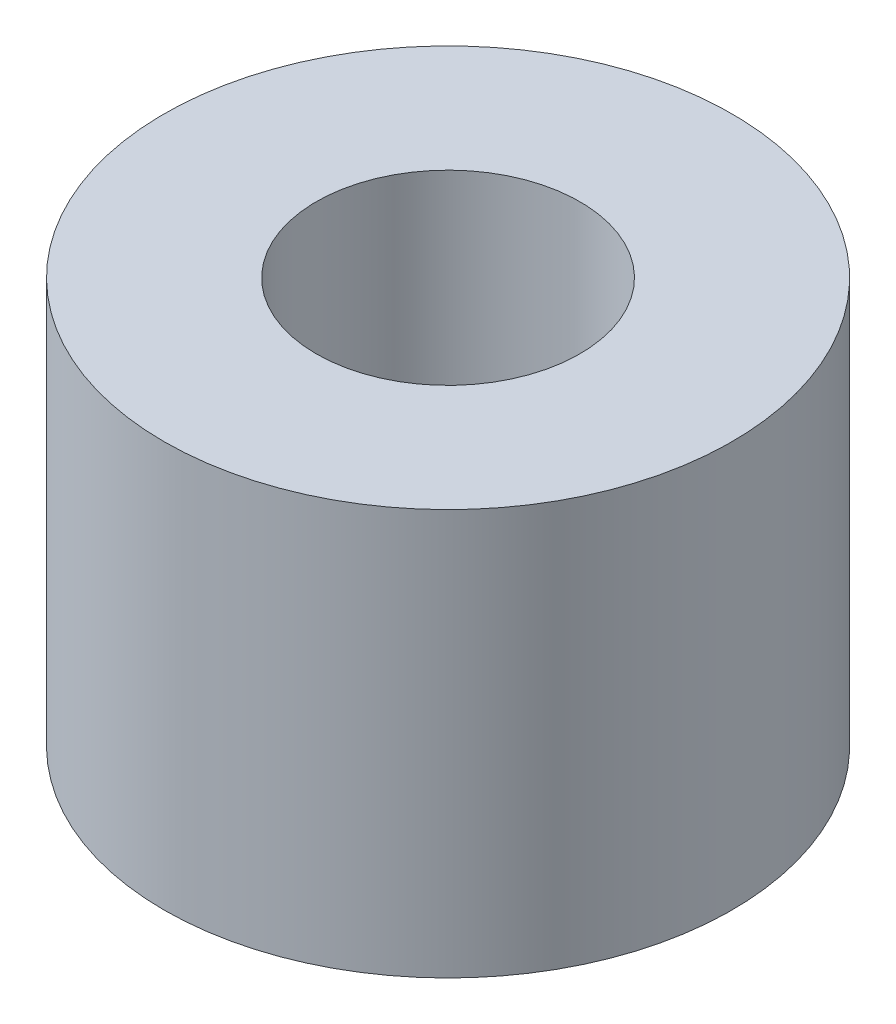
ISO-10303-21;
HEADER;
FILE_DESCRIPTION(('STEP AP214'),'2;1');
FILE_NAME('part.step','',(''),(''),'','','');
FILE_SCHEMA(('AUTOMOTIVE_DESIGN { 1 0 10303 214 1 1 1 1 }'));
ENDSEC;
DATA;
#1=APPLICATION_CONTEXT('core data for automotive mechanical design processes');
#2=APPLICATION_PROTOCOL_DEFINITION('international standard','automotive_design',2000,#1);
#3=PRODUCT_CONTEXT('',#1,'mechanical');
#4=PRODUCT('Part','Part','',(#3));
#5=PRODUCT_RELATED_PRODUCT_CATEGORY('part','',(#4));
#6=PRODUCT_DEFINITION_FORMATION('','',#4);
#7=PRODUCT_DEFINITION_CONTEXT('part definition',#1,'design');
#8=PRODUCT_DEFINITION('design','',#6,#7);
#9=PRODUCT_DEFINITION_SHAPE('','',#8);
#10=(LENGTH_UNIT() NAMED_UNIT(*) SI_UNIT(.MILLI.,.METRE.));
#11=(NAMED_UNIT(*) PLANE_ANGLE_UNIT() SI_UNIT($,.RADIAN.));
#12=(NAMED_UNIT(*) SI_UNIT($,.STERADIAN.) SOLID_ANGLE_UNIT());
#13=UNCERTAINTY_MEASURE_WITH_UNIT(LENGTH_MEASURE(1.E-05),#10,'distance_accuracy_value','');
#14=(GEOMETRIC_REPRESENTATION_CONTEXT(3) GLOBAL_UNCERTAINTY_ASSIGNED_CONTEXT((#13)) GLOBAL_UNIT_ASSIGNED_CONTEXT((#10,
#11,#12)) REPRESENTATION_CONTEXT('',''));
#15=CARTESIAN_POINT('',(0.,0.,0.));
#16=DIRECTION('',(0.,0.,1.));
#17=DIRECTION('',(1.,0.,0.));
#18=AXIS2_PLACEMENT_3D('',#15,#16,#17);
#19=CARTESIAN_POINT('',(0.,8.,0.));
#20=DIRECTION('',(0.,1.,0.));
#21=DIRECTION('',(0.,0.,1.));
#22=AXIS2_PLACEMENT_3D('',#19,#20,#21);
#23=PLANE('',#22);
#24=CARTESIAN_POINT('',(0.,8.,0.));
#25=DIRECTION('',(0.,1.,0.));
#26=DIRECTION('',(0.,0.,1.));
#27=AXIS2_PLACEMENT_3D('',#24,#25,#26);
#28=CIRCLE('',#27,5.6);
#29=CARTESIAN_POINT('',(0.,8.,5.6));
#30=VERTEX_POINT('',#29);
#31=EDGE_CURVE('E10',#30,#30,#28,.T.);
#32=ORIENTED_EDGE('',*,*,#31,.T.);
#33=EDGE_LOOP('',(#32));
#34=FACE_BOUND('',#33,.T.);
#35=CARTESIAN_POINT('',(0.,8.,0.));
#36=DIRECTION('',(0.,1.,0.));
#37=DIRECTION('',(0.,0.,1.));
#38=AXIS2_PLACEMENT_3D('',#35,#36,#37);
#39=CIRCLE('',#38,2.6);
#40=CARTESIAN_POINT('',(0.,8.,2.6));
#41=VERTEX_POINT('',#40);
#42=EDGE_CURVE('E54',#41,#41,#39,.T.);
#43=ORIENTED_EDGE('',*,*,#42,.F.);
#44=EDGE_LOOP('',(#43));
#45=FACE_BOUND('',#44,.T.);
#46=ADVANCED_FACE('F41',(#34,#45),#23,.T.);
#47=CARTESIAN_POINT('',(0.,0.,0.));
#48=DIRECTION('',(0.,1.,0.));
#49=DIRECTION('',(0.,0.,1.));
#50=AXIS2_PLACEMENT_3D('',#47,#48,#49);
#51=PLANE('',#50);
#52=CARTESIAN_POINT('',(0.,0.,0.));
#53=DIRECTION('',(0.,1.,0.));
#54=DIRECTION('',(0.,0.,1.));
#55=AXIS2_PLACEMENT_3D('',#52,#53,#54);
#56=CIRCLE('',#55,5.6);
#57=CARTESIAN_POINT('',(0.,0.,5.6));
#58=VERTEX_POINT('',#57);
#59=EDGE_CURVE('E45',#58,#58,#56,.T.);
#60=ORIENTED_EDGE('',*,*,#59,.F.);
#61=EDGE_LOOP('',(#60));
#62=FACE_BOUND('',#61,.T.);
#63=CARTESIAN_POINT('',(0.,0.,0.));
#64=DIRECTION('',(0.,1.,0.));
#65=DIRECTION('',(0.,0.,1.));
#66=AXIS2_PLACEMENT_3D('',#63,#64,#65);
#67=CIRCLE('',#66,2.6);
#68=CARTESIAN_POINT('',(0.,0.,2.6));
#69=VERTEX_POINT('',#68);
#70=EDGE_CURVE('E56',#69,#69,#67,.T.);
#71=ORIENTED_EDGE('',*,*,#70,.T.);
#72=EDGE_LOOP('',(#71));
#73=FACE_BOUND('',#72,.T.);
#74=ADVANCED_FACE('F68',(#62,#73),#51,.F.);
#75=CARTESIAN_POINT('',(0.,8.,0.));
#76=DIRECTION('',(0.,-1.,0.));
#77=DIRECTION('',(0.,0.,-1.));
#78=AXIS2_PLACEMENT_3D('',#75,#76,#77);
#79=CYLINDRICAL_SURFACE('',#78,5.6);
#80=ORIENTED_EDGE('',*,*,#31,.F.);
#81=EDGE_LOOP('',(#80));
#82=FACE_BOUND('',#81,.T.);
#83=ORIENTED_EDGE('',*,*,#59,.T.);
#84=EDGE_LOOP('',(#83));
#85=FACE_BOUND('',#84,.T.);
#86=ADVANCED_FACE('F43',(#82,#85),#79,.T.);
#87=CARTESIAN_POINT('',(0.,8.,0.));
#88=DIRECTION('',(0.,-1.,0.));
#89=DIRECTION('',(0.,0.,-1.));
#90=AXIS2_PLACEMENT_3D('',#87,#88,#89);
#91=CYLINDRICAL_SURFACE('',#90,2.6);
#92=ORIENTED_EDGE('',*,*,#42,.T.);
#93=EDGE_LOOP('',(#92));
#94=FACE_BOUND('',#93,.T.);
#95=ORIENTED_EDGE('',*,*,#70,.F.);
#96=EDGE_LOOP('',(#95));
#97=FACE_BOUND('',#96,.T.);
#98=ADVANCED_FACE('F64',(#94,#97),#91,.F.);
#99=CLOSED_SHELL('',(#46,#74,#86,#98));
#100=MANIFOLD_SOLID_BREP('B2',#99);
#101=ADVANCED_BREP_SHAPE_REPRESENTATION('',(#18,#100),#14);
#102=SHAPE_DEFINITION_REPRESENTATION(#9,#101);
ENDSEC;
END-ISO-10303-21;
